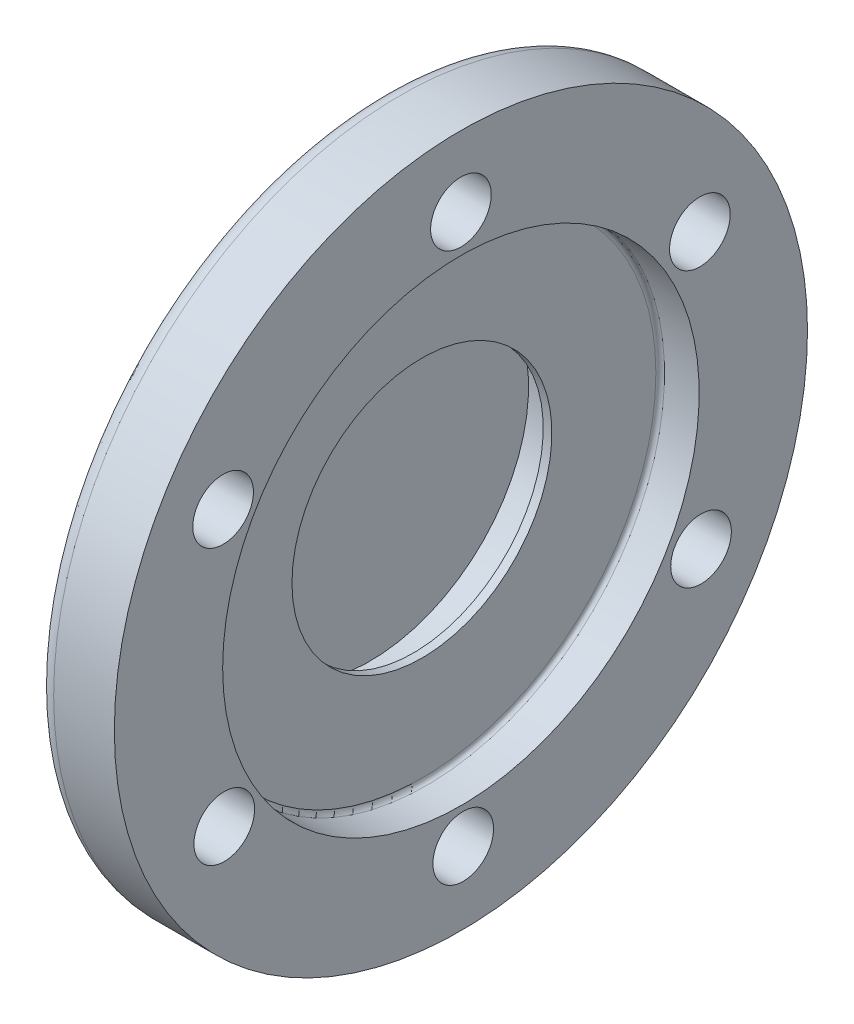
ISO-10303-21;
HEADER;
FILE_DESCRIPTION(('STEP AP214'),'2;1');
FILE_NAME('part.step','',(''),(''),'','','');
FILE_SCHEMA(('AUTOMOTIVE_DESIGN { 1 0 10303 214 1 1 1 1 }'));
ENDSEC;
DATA;
#1=APPLICATION_CONTEXT('core data for automotive mechanical design processes');
#2=APPLICATION_PROTOCOL_DEFINITION('international standard','automotive_design',2000,#1);
#3=PRODUCT_CONTEXT('',#1,'mechanical');
#4=PRODUCT('Part','Part','',(#3));
#5=PRODUCT_RELATED_PRODUCT_CATEGORY('part','',(#4));
#6=PRODUCT_DEFINITION_FORMATION('','',#4);
#7=PRODUCT_DEFINITION_CONTEXT('part definition',#1,'design');
#8=PRODUCT_DEFINITION('design','',#6,#7);
#9=PRODUCT_DEFINITION_SHAPE('','',#8);
#10=(LENGTH_UNIT() NAMED_UNIT(*) SI_UNIT(.MILLI.,.METRE.));
#11=(NAMED_UNIT(*) PLANE_ANGLE_UNIT() SI_UNIT($,.RADIAN.));
#12=(NAMED_UNIT(*) SI_UNIT($,.STERADIAN.) SOLID_ANGLE_UNIT());
#13=UNCERTAINTY_MEASURE_WITH_UNIT(LENGTH_MEASURE(1.E-05),#10,'distance_accuracy_value','');
#14=(GEOMETRIC_REPRESENTATION_CONTEXT(3) GLOBAL_UNCERTAINTY_ASSIGNED_CONTEXT((#13)) GLOBAL_UNIT_ASSIGNED_CONTEXT((#10,
#11,#12)) REPRESENTATION_CONTEXT('',''));
#15=CARTESIAN_POINT('',(0.,0.,0.));
#16=DIRECTION('',(0.,0.,1.));
#17=DIRECTION('',(1.,0.,0.));
#18=AXIS2_PLACEMENT_3D('',#15,#16,#17);
#19=CARTESIAN_POINT('',(-3.25197173447689,0.,-36.6187912045642));
#20=DIRECTION('',(1.,0.,0.));
#21=DIRECTION('',(0.,0.,-1.));
#22=AXIS2_PLACEMENT_3D('',#19,#20,#21);
#23=PLANE('',#22);
#24=CARTESIAN_POINT('',(-3.25197173447689,0.,0.));
#25=DIRECTION('',(-1.,0.,0.));
#26=DIRECTION('',(0.,0.,1.));
#27=AXIS2_PLACEMENT_3D('',#24,#25,#26);
#28=CIRCLE('',#27,30.);
#29=CARTESIAN_POINT('',(-3.25197173447689,0.,30.));
#30=VERTEX_POINT('',#29);
#31=EDGE_CURVE('E96',#30,#30,#28,.T.);
#32=ORIENTED_EDGE('',*,*,#31,.F.);
#33=EDGE_LOOP('',(#32));
#34=FACE_BOUND('',#33,.T.);
#35=CARTESIAN_POINT('',(-3.25197173447689,0.,0.));
#36=DIRECTION('',(-1.,0.,0.));
#37=DIRECTION('',(0.,0.,1.));
#38=AXIS2_PLACEMENT_3D('',#35,#36,#37);
#39=CIRCLE('',#38,36.6187912045642);
#40=CARTESIAN_POINT('',(-3.25197173447689,0.,36.6187912045642));
#41=VERTEX_POINT('',#40);
#42=EDGE_CURVE('E68',#41,#41,#39,.T.);
#43=ORIENTED_EDGE('',*,*,#42,.T.);
#44=EDGE_LOOP('',(#43));
#45=FACE_BOUND('',#44,.T.);
#46=ADVANCED_FACE('F44',(#34,#45),#23,.F.);
#47=CARTESIAN_POINT('',(0.,0.,0.));
#48=DIRECTION('',(-1.,0.,0.));
#49=DIRECTION('',(0.,0.,1.));
#50=AXIS2_PLACEMENT_3D('',#47,#48,#49);
#51=CYLINDRICAL_SURFACE('',#50,36.6187912045642);
#52=ORIENTED_EDGE('',*,*,#42,.F.);
#53=EDGE_LOOP('',(#52));
#54=FACE_BOUND('',#53,.T.);
#55=CARTESIAN_POINT('',(-13.2556394152143,0.,0.));
#56=DIRECTION('',(-1.,0.,0.));
#57=DIRECTION('',(0.,0.,1.));
#58=AXIS2_PLACEMENT_3D('',#55,#56,#57);
#59=CIRCLE('',#58,36.6187912045642);
#60=CARTESIAN_POINT('',(-13.2556394152143,0.,36.6187912045642));
#61=VERTEX_POINT('',#60);
#62=EDGE_CURVE('E72',#61,#61,#59,.T.);
#63=ORIENTED_EDGE('',*,*,#62,.T.);
#64=EDGE_LOOP('',(#63));
#65=FACE_BOUND('',#64,.T.);
#66=ADVANCED_FACE('F187',(#54,#65),#51,.F.);
#67=CARTESIAN_POINT('',(-13.2556394152143,0.,-36.6187912045642));
#68=DIRECTION('',(-1.,0.,0.));
#69=DIRECTION('',(0.,0.,1.));
#70=AXIS2_PLACEMENT_3D('',#67,#68,#69);
#71=PLANE('',#70);
#72=ORIENTED_EDGE('',*,*,#62,.F.);
#73=EDGE_LOOP('',(#72));
#74=FACE_BOUND('',#73,.T.);
#75=ADVANCED_FACE('F193',(#74),#71,.F.);
#76=CARTESIAN_POINT('',(7.74802826552311,0.,-55.));
#77=DIRECTION('',(-1.,0.,0.));
#78=DIRECTION('',(0.,0.,1.));
#79=AXIS2_PLACEMENT_3D('',#76,#77,#78);
#80=PLANE('',#79);
#81=CARTESIAN_POINT('',(7.74802826552311,63.6906043977179,0.));
#82=DIRECTION('',(-1.,0.,0.));
#83=DIRECTION('',(0.,0.,1.));
#84=AXIS2_PLACEMENT_3D('',#81,#82,#83);
#85=CIRCLE('',#84,6.99999999999999);
#86=CARTESIAN_POINT('',(7.74802826552311,63.6906043977179,6.99999999999999));
#87=VERTEX_POINT('',#86);
#88=EDGE_CURVE('E144',#87,#87,#85,.T.);
#89=ORIENTED_EDGE('',*,*,#88,.T.);
#90=EDGE_LOOP('',(#89));
#91=FACE_BOUND('',#90,.T.);
#92=CARTESIAN_POINT('',(7.74802826552311,31.6906043977202,54.8897369394144));
#93=DIRECTION('',(-1.,0.,0.));
#94=DIRECTION('',(0.,0.,1.));
#95=AXIS2_PLACEMENT_3D('',#92,#93,#94);
#96=CIRCLE('',#95,7.);
#97=CARTESIAN_POINT('',(7.74802826552311,31.6906043977202,61.8897369394144));
#98=VERTEX_POINT('',#97);
#99=EDGE_CURVE('E136',#98,#98,#96,.T.);
#100=ORIENTED_EDGE('',*,*,#99,.T.);
#101=EDGE_LOOP('',(#100));
#102=FACE_BOUND('',#101,.T.);
#103=CARTESIAN_POINT('',(7.74802826552311,-31.8453021988566,54.6217924880216));
#104=DIRECTION('',(-1.,0.,0.));
#105=DIRECTION('',(0.,0.,1.));
#106=AXIS2_PLACEMENT_3D('',#103,#104,#105);
#107=CIRCLE('',#106,7.);
#108=CARTESIAN_POINT('',(7.74802826552311,-31.8453021988566,61.6217924880216));
#109=VERTEX_POINT('',#108);
#110=EDGE_CURVE('E128',#109,#109,#107,.T.);
#111=ORIENTED_EDGE('',*,*,#110,.T.);
#112=EDGE_LOOP('',(#111));
#113=FACE_BOUND('',#112,.T.);
#114=CARTESIAN_POINT('',(7.74802826552311,-63.3812087954358,-0.535888902785634));
#115=DIRECTION('',(-1.,0.,0.));
#116=DIRECTION('',(0.,0.,1.));
#117=AXIS2_PLACEMENT_3D('',#114,#115,#116);
#118=CIRCLE('',#117,7.);
#119=CARTESIAN_POINT('',(7.74802826552311,-63.3812087954358,6.46411109721436));
#120=VERTEX_POINT('',#119);
#121=EDGE_CURVE('E120',#120,#120,#118,.T.);
#122=ORIENTED_EDGE('',*,*,#121,.T.);
#123=EDGE_LOOP('',(#122));
#124=FACE_BOUND('',#123,.T.);
#125=CARTESIAN_POINT('',(7.74802826552311,-31.3812087954381,-55.4256258422));
#126=DIRECTION('',(-1.,0.,0.));
#127=DIRECTION('',(0.,0.,1.));
#128=AXIS2_PLACEMENT_3D('',#125,#126,#127);
#129=CIRCLE('',#128,7.);
#130=CARTESIAN_POINT('',(7.74802826552311,-31.3812087954381,-48.4256258422));
#131=VERTEX_POINT('',#130);
#132=EDGE_CURVE('E112',#131,#131,#129,.T.);
#133=ORIENTED_EDGE('',*,*,#132,.T.);
#134=EDGE_LOOP('',(#133));
#135=FACE_BOUND('',#134,.T.);
#136=CARTESIAN_POINT('',(7.74802826552311,32.1546978011388,-55.1576813908072));
#137=DIRECTION('',(-1.,0.,0.));
#138=DIRECTION('',(0.,0.,1.));
#139=AXIS2_PLACEMENT_3D('',#136,#137,#138);
#140=CIRCLE('',#139,7.);
#141=CARTESIAN_POINT('',(7.74802826552311,32.1546978011388,-48.1576813908072));
#142=VERTEX_POINT('',#141);
#143=EDGE_CURVE('E104',#142,#142,#140,.T.);
#144=ORIENTED_EDGE('',*,*,#143,.T.);
#145=EDGE_LOOP('',(#144));
#146=FACE_BOUND('',#145,.T.);
#147=CARTESIAN_POINT('',(7.74802826552311,0.,0.));
#148=DIRECTION('',(-1.,0.,0.));
#149=DIRECTION('',(0.,0.,1.));
#150=AXIS2_PLACEMENT_3D('',#147,#148,#149);
#151=CIRCLE('',#150,55.);
#152=CARTESIAN_POINT('',(7.74802826552311,0.,55.));
#153=VERTEX_POINT('',#152);
#154=EDGE_CURVE('E88',#153,#153,#151,.T.);
#155=ORIENTED_EDGE('',*,*,#154,.T.);
#156=EDGE_LOOP('',(#155));
#157=FACE_BOUND('',#156,.T.);
#158=CARTESIAN_POINT('',(7.74802826552311,0.,0.));
#159=DIRECTION('',(1.,0.,0.));
#160=DIRECTION('',(0.,0.,-1.));
#161=AXIS2_PLACEMENT_3D('',#158,#159,#160);
#162=CIRCLE('',#161,80.);
#163=CARTESIAN_POINT('',(7.74802826552311,0.,-80.));
#164=VERTEX_POINT('',#163);
#165=EDGE_CURVE('E100',#164,#164,#162,.T.);
#166=ORIENTED_EDGE('',*,*,#165,.T.);
#167=EDGE_LOOP('',(#166));
#168=FACE_BOUND('',#167,.T.);
#169=ADVANCED_FACE('F221',(#91,#102,#113,#124,#135,#146,#157,#168),#80,.F.);
#170=CARTESIAN_POINT('',(0.,0.,0.));
#171=DIRECTION('',(-1.,0.,0.));
#172=DIRECTION('',(0.,0.,1.));
#173=AXIS2_PLACEMENT_3D('',#170,#171,#172);
#174=CYLINDRICAL_SURFACE('',#173,55.);
#175=CARTESIAN_POINT('',(-0.251971734476887,0.,0.));
#176=DIRECTION('',(-1.,0.,0.));
#177=DIRECTION('',(0.,0.,1.));
#178=AXIS2_PLACEMENT_3D('',#175,#176,#177);
#179=CIRCLE('',#178,55.);
#180=CARTESIAN_POINT('',(-0.251971734476887,0.,55.));
#181=VERTEX_POINT('',#180);
#182=EDGE_CURVE('E52',#181,#181,#179,.T.);
#183=ORIENTED_EDGE('',*,*,#182,.T.);
#184=EDGE_LOOP('',(#183));
#185=FACE_BOUND('',#184,.T.);
#186=ORIENTED_EDGE('',*,*,#154,.F.);
#187=EDGE_LOOP('',(#186));
#188=FACE_BOUND('',#187,.T.);
#189=ADVANCED_FACE('F223',(#185,#188),#174,.F.);
#190=CARTESIAN_POINT('',(-1.25197173447689,0.,-30.));
#191=DIRECTION('',(-1.,0.,0.));
#192=DIRECTION('',(0.,0.,1.));
#193=AXIS2_PLACEMENT_3D('',#190,#191,#192);
#194=PLANE('',#193);
#195=CARTESIAN_POINT('',(-1.25197173447689,0.,0.));
#196=DIRECTION('',(-1.,0.,0.));
#197=DIRECTION('',(0.,0.,1.));
#198=AXIS2_PLACEMENT_3D('',#195,#196,#197);
#199=CIRCLE('',#198,54.);
#200=CARTESIAN_POINT('',(-1.25197173447689,0.,54.));
#201=VERTEX_POINT('',#200);
#202=EDGE_CURVE('E10',#201,#201,#199,.F.);
#203=ORIENTED_EDGE('',*,*,#202,.T.);
#204=EDGE_LOOP('',(#203));
#205=FACE_BOUND('',#204,.T.);
#206=CARTESIAN_POINT('',(-1.25197173447689,0.,0.));
#207=DIRECTION('',(-1.,0.,0.));
#208=DIRECTION('',(0.,0.,1.));
#209=AXIS2_PLACEMENT_3D('',#206,#207,#208);
#210=CIRCLE('',#209,30.);
#211=CARTESIAN_POINT('',(-1.25197173447689,0.,30.));
#212=VERTEX_POINT('',#211);
#213=EDGE_CURVE('E92',#212,#212,#210,.T.);
#214=ORIENTED_EDGE('',*,*,#213,.T.);
#215=EDGE_LOOP('',(#214));
#216=FACE_BOUND('',#215,.T.);
#217=ADVANCED_FACE('F231',(#205,#216),#194,.F.);
#218=CARTESIAN_POINT('',(0.,0.,0.));
#219=DIRECTION('',(-1.,0.,0.));
#220=DIRECTION('',(0.,0.,1.));
#221=AXIS2_PLACEMENT_3D('',#218,#219,#220);
#222=CYLINDRICAL_SURFACE('',#221,30.);
#223=ORIENTED_EDGE('',*,*,#213,.F.);
#224=EDGE_LOOP('',(#223));
#225=FACE_BOUND('',#224,.T.);
#226=ORIENTED_EDGE('',*,*,#31,.T.);
#227=EDGE_LOOP('',(#226));
#228=FACE_BOUND('',#227,.T.);
#229=ADVANCED_FACE('F238',(#225,#228),#222,.F.);
#230=CARTESIAN_POINT('',(-18.1652143576752,0.,-45.));
#231=DIRECTION('',(1.,0.,0.));
#232=DIRECTION('',(0.,0.,-1.));
#233=AXIS2_PLACEMENT_3D('',#230,#231,#232);
#234=PLANE('',#233);
#235=CARTESIAN_POINT('',(-18.1652143576752,0.,0.));
#236=DIRECTION('',(-1.,0.,0.));
#237=DIRECTION('',(0.,0.,1.));
#238=AXIS2_PLACEMENT_3D('',#235,#236,#237);
#239=CIRCLE('',#238,45.);
#240=CARTESIAN_POINT('',(-18.1652143576752,0.,45.));
#241=VERTEX_POINT('',#240);
#242=EDGE_CURVE('E76',#241,#241,#239,.T.);
#243=ORIENTED_EDGE('',*,*,#242,.T.);
#244=EDGE_LOOP('',(#243));
#245=FACE_BOUND('',#244,.T.);
#246=ADVANCED_FACE('F182',(#245),#234,.F.);
#247=CARTESIAN_POINT('',(0.,0.,0.));
#248=DIRECTION('',(-1.,0.,0.));
#249=DIRECTION('',(0.,0.,1.));
#250=AXIS2_PLACEMENT_3D('',#247,#248,#249);
#251=CYLINDRICAL_SURFACE('',#250,45.);
#252=ORIENTED_EDGE('',*,*,#242,.F.);
#253=EDGE_LOOP('',(#252));
#254=FACE_BOUND('',#253,.T.);
#255=CARTESIAN_POINT('',(-13.2556394152143,0.,0.));
#256=DIRECTION('',(-1.,0.,0.));
#257=DIRECTION('',(0.,0.,1.));
#258=AXIS2_PLACEMENT_3D('',#255,#256,#257);
#259=CIRCLE('',#258,45.);
#260=CARTESIAN_POINT('',(-13.2556394152143,0.,45.));
#261=VERTEX_POINT('',#260);
#262=EDGE_CURVE('E80',#261,#261,#259,.T.);
#263=ORIENTED_EDGE('',*,*,#262,.T.);
#264=EDGE_LOOP('',(#263));
#265=FACE_BOUND('',#264,.T.);
#266=ADVANCED_FACE('F175',(#254,#265),#251,.T.);
#267=CARTESIAN_POINT('',(-13.2556394152143,0.,0.));
#268=DIRECTION('',(-1.,0.,0.));
#269=DIRECTION('',(0.,0.,1.));
#270=AXIS2_PLACEMENT_3D('',#267,#268,#269);
#271=TOROIDAL_SURFACE('',#270,48.,3.);
#272=ORIENTED_EDGE('',*,*,#262,.F.);
#273=EDGE_LOOP('',(#272));
#274=FACE_BOUND('',#273,.T.);
#275=CARTESIAN_POINT('',(-10.2556394152143,0.,0.));
#276=DIRECTION('',(-1.,0.,0.));
#277=DIRECTION('',(0.,0.,1.));
#278=AXIS2_PLACEMENT_3D('',#275,#276,#277);
#279=CIRCLE('',#278,48.);
#280=CARTESIAN_POINT('',(-10.2556394152143,0.,48.));
#281=VERTEX_POINT('',#280);
#282=EDGE_CURVE('E84',#281,#281,#279,.T.);
#283=ORIENTED_EDGE('',*,*,#282,.T.);
#284=EDGE_LOOP('',(#283));
#285=FACE_BOUND('',#284,.T.);
#286=ADVANCED_FACE('F159',(#274,#285),#271,.F.);
#287=CARTESIAN_POINT('',(-10.2556394152143,0.,-80.));
#288=DIRECTION('',(1.,0.,0.));
#289=DIRECTION('',(0.,0.,-1.));
#290=AXIS2_PLACEMENT_3D('',#287,#288,#289);
#291=PLANE('',#290);
#292=CARTESIAN_POINT('',(-10.2556394152143,0.,0.));
#293=DIRECTION('',(1.,0.,0.));
#294=DIRECTION('',(0.,0.,-1.));
#295=AXIS2_PLACEMENT_3D('',#292,#293,#294);
#296=CIRCLE('',#295,76.);
#297=CARTESIAN_POINT('',(-10.2556394152143,0.,-76.));
#298=VERTEX_POINT('',#297);
#299=EDGE_CURVE('E62',#298,#298,#296,.F.);
#300=ORIENTED_EDGE('',*,*,#299,.T.);
#301=EDGE_LOOP('',(#300));
#302=FACE_BOUND('',#301,.T.);
#303=CARTESIAN_POINT('',(-10.2556394152143,63.6906043977179,0.));
#304=DIRECTION('',(-1.,0.,0.));
#305=DIRECTION('',(0.,0.,1.));
#306=AXIS2_PLACEMENT_3D('',#303,#304,#305);
#307=CIRCLE('',#306,6.99999999999999);
#308=CARTESIAN_POINT('',(-10.2556394152143,63.6906043977179,6.99999999999999));
#309=VERTEX_POINT('',#308);
#310=EDGE_CURVE('E148',#309,#309,#307,.T.);
#311=ORIENTED_EDGE('',*,*,#310,.F.);
#312=EDGE_LOOP('',(#311));
#313=FACE_BOUND('',#312,.T.);
#314=CARTESIAN_POINT('',(-10.2556394152143,31.6906043977202,54.8897369394144));
#315=DIRECTION('',(-1.,0.,0.));
#316=DIRECTION('',(0.,0.,1.));
#317=AXIS2_PLACEMENT_3D('',#314,#315,#316);
#318=CIRCLE('',#317,6.99999999999999);
#319=CARTESIAN_POINT('',(-10.2556394152143,31.6906043977202,61.8897369394144));
#320=VERTEX_POINT('',#319);
#321=EDGE_CURVE('E140',#320,#320,#318,.T.);
#322=ORIENTED_EDGE('',*,*,#321,.F.);
#323=EDGE_LOOP('',(#322));
#324=FACE_BOUND('',#323,.T.);
#325=CARTESIAN_POINT('',(-10.2556394152143,-31.8453021988566,54.6217924880216));
#326=DIRECTION('',(-1.,0.,0.));
#327=DIRECTION('',(0.,0.,1.));
#328=AXIS2_PLACEMENT_3D('',#325,#326,#327);
#329=CIRCLE('',#328,6.99999999999999);
#330=CARTESIAN_POINT('',(-10.2556394152143,-31.8453021988566,61.6217924880216));
#331=VERTEX_POINT('',#330);
#332=EDGE_CURVE('E132',#331,#331,#329,.T.);
#333=ORIENTED_EDGE('',*,*,#332,.F.);
#334=EDGE_LOOP('',(#333));
#335=FACE_BOUND('',#334,.T.);
#336=CARTESIAN_POINT('',(-10.2556394152143,-63.3812087954358,-0.535888902785634));
#337=DIRECTION('',(-1.,0.,0.));
#338=DIRECTION('',(0.,0.,1.));
#339=AXIS2_PLACEMENT_3D('',#336,#337,#338);
#340=CIRCLE('',#339,6.99999999999999);
#341=CARTESIAN_POINT('',(-10.2556394152143,-63.3812087954358,6.46411109721435));
#342=VERTEX_POINT('',#341);
#343=EDGE_CURVE('E124',#342,#342,#340,.T.);
#344=ORIENTED_EDGE('',*,*,#343,.F.);
#345=EDGE_LOOP('',(#344));
#346=FACE_BOUND('',#345,.T.);
#347=CARTESIAN_POINT('',(-10.2556394152143,-31.3812087954381,-55.4256258422));
#348=DIRECTION('',(-1.,0.,0.));
#349=DIRECTION('',(0.,0.,1.));
#350=AXIS2_PLACEMENT_3D('',#347,#348,#349);
#351=CIRCLE('',#350,6.99999999999999);
#352=CARTESIAN_POINT('',(-10.2556394152143,-31.3812087954381,-48.4256258422));
#353=VERTEX_POINT('',#352);
#354=EDGE_CURVE('E116',#353,#353,#351,.T.);
#355=ORIENTED_EDGE('',*,*,#354,.F.);
#356=EDGE_LOOP('',(#355));
#357=FACE_BOUND('',#356,.T.);
#358=CARTESIAN_POINT('',(-10.2556394152143,32.1546978011388,-55.1576813908072));
#359=DIRECTION('',(-1.,0.,0.));
#360=DIRECTION('',(0.,0.,1.));
#361=AXIS2_PLACEMENT_3D('',#358,#359,#360);
#362=CIRCLE('',#361,6.99999999999999);
#363=CARTESIAN_POINT('',(-10.2556394152143,32.1546978011388,-48.1576813908072));
#364=VERTEX_POINT('',#363);
#365=EDGE_CURVE('E108',#364,#364,#362,.T.);
#366=ORIENTED_EDGE('',*,*,#365,.F.);
#367=EDGE_LOOP('',(#366));
#368=FACE_BOUND('',#367,.T.);
#369=ORIENTED_EDGE('',*,*,#282,.F.);
#370=EDGE_LOOP('',(#369));
#371=FACE_BOUND('',#370,.T.);
#372=ADVANCED_FACE('F155',(#302,#313,#324,#335,#346,#357,#368,#371),#291,.F.);
#373=CARTESIAN_POINT('',(0.,0.,0.));
#374=DIRECTION('',(-1.,0.,0.));
#375=DIRECTION('',(0.,0.,1.));
#376=AXIS2_PLACEMENT_3D('',#373,#374,#375);
#377=CYLINDRICAL_SURFACE('',#376,80.);
#378=CARTESIAN_POINT('',(-6.2556394152143,0.,0.));
#379=DIRECTION('',(1.,0.,0.));
#380=DIRECTION('',(0.,0.,-1.));
#381=AXIS2_PLACEMENT_3D('',#378,#379,#380);
#382=CIRCLE('',#381,80.);
#383=CARTESIAN_POINT('',(-6.2556394152143,0.,-80.));
#384=VERTEX_POINT('',#383);
#385=EDGE_CURVE('E57',#384,#384,#382,.T.);
#386=ORIENTED_EDGE('',*,*,#385,.T.);
#387=EDGE_LOOP('',(#386));
#388=FACE_BOUND('',#387,.T.);
#389=ORIENTED_EDGE('',*,*,#165,.F.);
#390=EDGE_LOOP('',(#389));
#391=FACE_BOUND('',#390,.T.);
#392=ADVANCED_FACE('F158',(#388,#391),#377,.T.);
#393=CARTESIAN_POINT('',(-10.2556394152143,32.1546978011388,-55.1576813908072));
#394=DIRECTION('',(-1.,0.,0.));
#395=DIRECTION('',(0.,0.,1.));
#396=AXIS2_PLACEMENT_3D('',#393,#394,#395);
#397=CYLINDRICAL_SURFACE('',#396,6.99999999999999);
#398=ORIENTED_EDGE('',*,*,#143,.F.);
#399=EDGE_LOOP('',(#398));
#400=FACE_BOUND('',#399,.T.);
#401=ORIENTED_EDGE('',*,*,#365,.T.);
#402=EDGE_LOOP('',(#401));
#403=FACE_BOUND('',#402,.T.);
#404=ADVANCED_FACE('F217',(#400,#403),#397,.F.);
#405=CARTESIAN_POINT('',(-10.2556394152143,-31.3812087954381,-55.4256258422));
#406=DIRECTION('',(-1.,0.,0.));
#407=DIRECTION('',(0.,0.,1.));
#408=AXIS2_PLACEMENT_3D('',#405,#406,#407);
#409=CYLINDRICAL_SURFACE('',#408,6.99999999999999);
#410=ORIENTED_EDGE('',*,*,#132,.F.);
#411=EDGE_LOOP('',(#410));
#412=FACE_BOUND('',#411,.T.);
#413=ORIENTED_EDGE('',*,*,#354,.T.);
#414=EDGE_LOOP('',(#413));
#415=FACE_BOUND('',#414,.T.);
#416=ADVANCED_FACE('F244',(#412,#415),#409,.F.);
#417=CARTESIAN_POINT('',(-10.2556394152143,-63.3812087954358,-0.535888902785634));
#418=DIRECTION('',(-1.,0.,0.));
#419=DIRECTION('',(0.,0.,1.));
#420=AXIS2_PLACEMENT_3D('',#417,#418,#419);
#421=CYLINDRICAL_SURFACE('',#420,6.99999999999999);
#422=ORIENTED_EDGE('',*,*,#121,.F.);
#423=EDGE_LOOP('',(#422));
#424=FACE_BOUND('',#423,.T.);
#425=ORIENTED_EDGE('',*,*,#343,.T.);
#426=EDGE_LOOP('',(#425));
#427=FACE_BOUND('',#426,.T.);
#428=ADVANCED_FACE('F248',(#424,#427),#421,.F.);
#429=CARTESIAN_POINT('',(-10.2556394152143,-31.8453021988566,54.6217924880216));
#430=DIRECTION('',(-1.,0.,0.));
#431=DIRECTION('',(0.,0.,1.));
#432=AXIS2_PLACEMENT_3D('',#429,#430,#431);
#433=CYLINDRICAL_SURFACE('',#432,6.99999999999999);
#434=ORIENTED_EDGE('',*,*,#110,.F.);
#435=EDGE_LOOP('',(#434));
#436=FACE_BOUND('',#435,.T.);
#437=ORIENTED_EDGE('',*,*,#332,.T.);
#438=EDGE_LOOP('',(#437));
#439=FACE_BOUND('',#438,.T.);
#440=ADVANCED_FACE('F252',(#436,#439),#433,.F.);
#441=CARTESIAN_POINT('',(-10.2556394152143,31.6906043977202,54.8897369394144));
#442=DIRECTION('',(-1.,0.,0.));
#443=DIRECTION('',(0.,0.,1.));
#444=AXIS2_PLACEMENT_3D('',#441,#442,#443);
#445=CYLINDRICAL_SURFACE('',#444,6.99999999999999);
#446=ORIENTED_EDGE('',*,*,#99,.F.);
#447=EDGE_LOOP('',(#446));
#448=FACE_BOUND('',#447,.T.);
#449=ORIENTED_EDGE('',*,*,#321,.T.);
#450=EDGE_LOOP('',(#449));
#451=FACE_BOUND('',#450,.T.);
#452=ADVANCED_FACE('F208',(#448,#451),#445,.F.);
#453=CARTESIAN_POINT('',(-10.2556394152143,63.6906043977179,0.));
#454=DIRECTION('',(-1.,0.,0.));
#455=DIRECTION('',(0.,0.,1.));
#456=AXIS2_PLACEMENT_3D('',#453,#454,#455);
#457=CYLINDRICAL_SURFACE('',#456,6.99999999999999);
#458=ORIENTED_EDGE('',*,*,#88,.F.);
#459=EDGE_LOOP('',(#458));
#460=FACE_BOUND('',#459,.T.);
#461=ORIENTED_EDGE('',*,*,#310,.T.);
#462=EDGE_LOOP('',(#461));
#463=FACE_BOUND('',#462,.T.);
#464=ADVANCED_FACE('F153',(#460,#463),#457,.F.);
#465=CARTESIAN_POINT('',(-6.2556394152143,0.,0.));
#466=DIRECTION('',(1.,0.,0.));
#467=DIRECTION('',(0.,0.,-1.));
#468=AXIS2_PLACEMENT_3D('',#465,#466,#467);
#469=TOROIDAL_SURFACE('',#468,76.,4.);
#470=ORIENTED_EDGE('',*,*,#385,.F.);
#471=EDGE_LOOP('',(#470));
#472=FACE_BOUND('',#471,.T.);
#473=ORIENTED_EDGE('',*,*,#299,.F.);
#474=EDGE_LOOP('',(#473));
#475=FACE_BOUND('',#474,.T.);
#476=ADVANCED_FACE('F199',(#472,#475),#469,.T.);
#477=CARTESIAN_POINT('',(-0.251971734476887,0.,0.));
#478=DIRECTION('',(-1.,0.,0.));
#479=DIRECTION('',(0.,0.,1.));
#480=AXIS2_PLACEMENT_3D('',#477,#478,#479);
#481=TOROIDAL_SURFACE('',#480,54.,1.);
#482=ORIENTED_EDGE('',*,*,#202,.F.);
#483=EDGE_LOOP('',(#482));
#484=FACE_BOUND('',#483,.T.);
#485=ORIENTED_EDGE('',*,*,#182,.F.);
#486=EDGE_LOOP('',(#485));
#487=FACE_BOUND('',#486,.T.);
#488=ADVANCED_FACE('F46',(#484,#487),#481,.F.);
#489=CLOSED_SHELL('',(#46,#66,#75,#169,#189,#217,#229,#246,#266,#286,#372,#392,#404,#416,#428,
#440,#452,#464,#476,#488));
#490=MANIFOLD_SOLID_BREP('B2',#489);
#491=ADVANCED_BREP_SHAPE_REPRESENTATION('',(#18,#490),#14);
#492=SHAPE_DEFINITION_REPRESENTATION(#9,#491);
ENDSEC;
END-ISO-10303-21;
